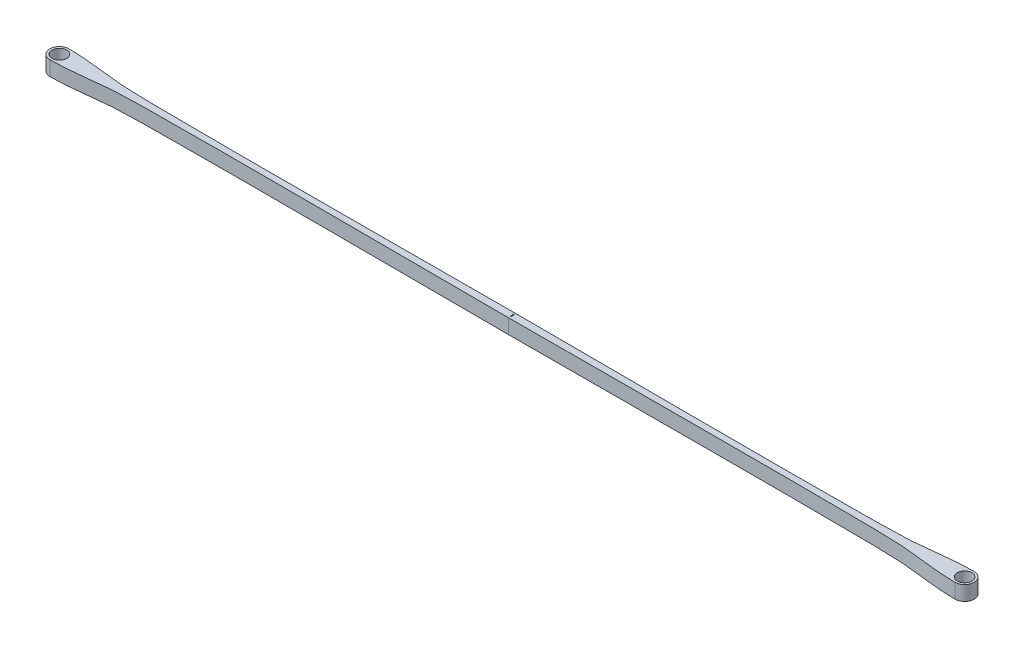
ISO-10303-21;
HEADER;
FILE_DESCRIPTION(('STEP AP214'),'2;1');
FILE_NAME('part.step','',(''),(''),'','','');
FILE_SCHEMA(('AUTOMOTIVE_DESIGN { 1 0 10303 214 1 1 1 1 }'));
ENDSEC;
DATA;
#1=APPLICATION_CONTEXT('core data for automotive mechanical design processes');
#2=APPLICATION_PROTOCOL_DEFINITION('international standard','automotive_design',2000,#1);
#3=PRODUCT_CONTEXT('',#1,'mechanical');
#4=PRODUCT('Part','Part','',(#3));
#5=PRODUCT_RELATED_PRODUCT_CATEGORY('part','',(#4));
#6=PRODUCT_DEFINITION_FORMATION('','',#4);
#7=PRODUCT_DEFINITION_CONTEXT('part definition',#1,'design');
#8=PRODUCT_DEFINITION('design','',#6,#7);
#9=PRODUCT_DEFINITION_SHAPE('','',#8);
#10=(LENGTH_UNIT() NAMED_UNIT(*) SI_UNIT(.MILLI.,.METRE.));
#11=(NAMED_UNIT(*) PLANE_ANGLE_UNIT() SI_UNIT($,.RADIAN.));
#12=(NAMED_UNIT(*) SI_UNIT($,.STERADIAN.) SOLID_ANGLE_UNIT());
#13=UNCERTAINTY_MEASURE_WITH_UNIT(LENGTH_MEASURE(1.E-05),#10,'distance_accuracy_value','');
#14=(GEOMETRIC_REPRESENTATION_CONTEXT(3) GLOBAL_UNCERTAINTY_ASSIGNED_CONTEXT((#13)) GLOBAL_UNIT_ASSIGNED_CONTEXT((#10,
#11,#12)) REPRESENTATION_CONTEXT('',''));
#15=CARTESIAN_POINT('',(0.,0.,0.));
#16=DIRECTION('',(0.,0.,1.));
#17=DIRECTION('',(1.,0.,0.));
#18=AXIS2_PLACEMENT_3D('',#15,#16,#17);
#19=CARTESIAN_POINT('',(0.,2.,1.30000507237961));
#20=CARTESIAN_POINT('',(2.1582956686711,2.,1.30000507237961));
#21=CARTESIAN_POINT('',(7.60592517311194,2.,0.548342251474103));
#22=CARTESIAN_POINT('',(11.061575129074,2.,0.324012224077829));
#23=CARTESIAN_POINT('',(61.9,2.,0.5));
#24=B_SPLINE_CURVE_WITH_KNOTS('',3,(#19,#20,#21,#22,#23),.UNSPECIFIED.,.F.,.F.,(4,1,4),(0.,
0.427834461323006,1.),.UNSPECIFIED.);
#25=DIRECTION('',(0.,-1.,0.));
#26=VECTOR('',#25,1.);
#27=SURFACE_OF_LINEAR_EXTRUSION('',#24,#26);
#28=CARTESIAN_POINT('',(0.,0.,1.30000507237961));
#29=CARTESIAN_POINT('',(2.1582956686711,0.,1.30000507237961));
#30=CARTESIAN_POINT('',(7.60592517311194,0.,0.548342251474103));
#31=CARTESIAN_POINT('',(11.061575129074,0.,0.324012224077829));
#32=CARTESIAN_POINT('',(61.9,0.,0.5));
#33=B_SPLINE_CURVE_WITH_KNOTS('',3,(#28,#29,#30,#31,#32),.UNSPECIFIED.,.F.,.F.,(4,1,4),(0.,
0.427834461323006,1.),.UNSPECIFIED.);
#34=CARTESIAN_POINT('',(0.,0.,1.30000507237961));
#35=VERTEX_POINT('',#34);
#36=CARTESIAN_POINT('',(61.9,0.,0.5));
#37=VERTEX_POINT('',#36);
#38=EDGE_CURVE('E280',#35,#37,#33,.T.);
#39=ORIENTED_EDGE('',*,*,#38,.T.);
#40=DIRECTION('',(0.,-1.,0.));
#41=VECTOR('',#40,1.);
#42=CARTESIAN_POINT('',(61.9,2.,0.5));
#43=LINE('',#42,#41);
#44=CARTESIAN_POINT('',(61.9,2.,0.5));
#45=VERTEX_POINT('',#44);
#46=EDGE_CURVE('E107',#45,#37,#43,.T.);
#47=ORIENTED_EDGE('',*,*,#46,.F.);
#48=CARTESIAN_POINT('',(0.,2.,1.30000507237961));
#49=VERTEX_POINT('',#48);
#50=EDGE_CURVE('E275',#49,#45,#24,.T.);
#51=ORIENTED_EDGE('',*,*,#50,.F.);
#52=DIRECTION('',(0.,-1.,0.));
#53=VECTOR('',#52,1.);
#54=CARTESIAN_POINT('',(0.,2.,1.30000507237961));
#55=LINE('',#54,#53);
#56=EDGE_CURVE('E14',#49,#35,#55,.T.);
#57=ORIENTED_EDGE('',*,*,#56,.T.);
#58=EDGE_LOOP('',(#39,#47,#51,#57));
#59=FACE_BOUND('',#58,.T.);
#60=ADVANCED_FACE('F98',(#59),#27,.F.);
#61=CARTESIAN_POINT('',(0.,2.,-1.30000507237961));
#62=CARTESIAN_POINT('',(2.1582956686711,2.,-1.30000507237961));
#63=CARTESIAN_POINT('',(7.60592517311194,2.,-0.548342251474103));
#64=CARTESIAN_POINT('',(11.061575129074,2.,-0.324012224077829));
#65=CARTESIAN_POINT('',(61.9,2.,-0.5));
#66=B_SPLINE_CURVE_WITH_KNOTS('',3,(#61,#62,#63,#64,#65),.UNSPECIFIED.,.F.,.F.,(4,1,4),(0.,
0.427834461323006,1.),.UNSPECIFIED.);
#67=DIRECTION('',(0.,-1.,0.));
#68=VECTOR('',#67,1.);
#69=SURFACE_OF_LINEAR_EXTRUSION('',#66,#68);
#70=CARTESIAN_POINT('',(0.,0.,-1.30000507237961));
#71=CARTESIAN_POINT('',(2.1582956686711,0.,-1.30000507237961));
#72=CARTESIAN_POINT('',(7.60592517311194,0.,-0.548342251474103));
#73=CARTESIAN_POINT('',(11.061575129074,0.,-0.324012224077829));
#74=CARTESIAN_POINT('',(61.9,0.,-0.5));
#75=B_SPLINE_CURVE_WITH_KNOTS('',3,(#70,#71,#72,#73,#74),.UNSPECIFIED.,.F.,.F.,(4,1,4),(0.,
0.427834461323006,1.),.UNSPECIFIED.);
#76=CARTESIAN_POINT('',(0.,0.,-1.30000507237961));
#77=VERTEX_POINT('',#76);
#78=CARTESIAN_POINT('',(61.9,0.,-0.5));
#79=VERTEX_POINT('',#78);
#80=EDGE_CURVE('E287',#77,#79,#75,.T.);
#81=ORIENTED_EDGE('',*,*,#80,.F.);
#82=DIRECTION('',(0.,-1.,0.));
#83=VECTOR('',#82,1.);
#84=CARTESIAN_POINT('',(0.,2.,-1.30000507237961));
#85=LINE('',#84,#83);
#86=CARTESIAN_POINT('',(0.,2.,-1.30000507237961));
#87=VERTEX_POINT('',#86);
#88=EDGE_CURVE('E124',#87,#77,#85,.T.);
#89=ORIENTED_EDGE('',*,*,#88,.F.);
#90=CARTESIAN_POINT('',(61.9,2.,-0.5));
#91=VERTEX_POINT('',#90);
#92=EDGE_CURVE('E270',#87,#91,#66,.T.);
#93=ORIENTED_EDGE('',*,*,#92,.T.);
#94=DIRECTION('',(0.,-1.,0.));
#95=VECTOR('',#94,1.);
#96=CARTESIAN_POINT('',(61.9,2.,-0.5));
#97=LINE('',#96,#95);
#98=EDGE_CURVE('E300',#91,#79,#97,.T.);
#99=ORIENTED_EDGE('',*,*,#98,.T.);
#100=EDGE_LOOP('',(#81,#89,#93,#99));
#101=FACE_BOUND('',#100,.T.);
#102=ADVANCED_FACE('F265',(#101),#69,.T.);
#103=CARTESIAN_POINT('',(0.,0.,0.));
#104=DIRECTION('',(0.,1.,0.));
#105=DIRECTION('',(0.,0.,1.));
#106=AXIS2_PLACEMENT_3D('',#103,#104,#105);
#107=PLANE('',#106);
#108=CARTESIAN_POINT('',(123.8,0.,0.));
#109=DIRECTION('',(0.,-1.,0.));
#110=DIRECTION('',(0.,0.,1.));
#111=AXIS2_PLACEMENT_3D('',#108,#109,#110);
#112=CIRCLE('',#111,1.);
#113=CARTESIAN_POINT('',(123.8,0.,1.));
#114=VERTEX_POINT('',#113);
#115=EDGE_CURVE('E219',#114,#114,#112,.T.);
#116=ORIENTED_EDGE('',*,*,#115,.F.);
#117=EDGE_LOOP('',(#116));
#118=FACE_BOUND('',#117,.T.);
#119=CARTESIAN_POINT('',(0.,0.,0.));
#120=DIRECTION('',(0.,1.,0.));
#121=DIRECTION('',(0.,0.,1.));
#122=AXIS2_PLACEMENT_3D('',#119,#120,#121);
#123=CIRCLE('',#122,1.);
#124=CARTESIAN_POINT('',(0.,0.,1.));
#125=VERTEX_POINT('',#124);
#126=EDGE_CURVE('E306',#125,#125,#123,.T.);
#127=ORIENTED_EDGE('',*,*,#126,.T.);
#128=EDGE_LOOP('',(#127));
#129=FACE_BOUND('',#128,.T.);
#130=ORIENTED_EDGE('',*,*,#38,.F.);
#131=CARTESIAN_POINT('',(0.,0.,0.));
#132=DIRECTION('',(0.,1.,0.));
#133=DIRECTION('',(0.,0.,1.));
#134=AXIS2_PLACEMENT_3D('',#131,#132,#133);
#135=CIRCLE('',#134,1.30000507237961);
#136=EDGE_CURVE('E102',#77,#35,#135,.T.);
#137=ORIENTED_EDGE('',*,*,#136,.F.);
#138=ORIENTED_EDGE('',*,*,#80,.T.);
#139=CARTESIAN_POINT('',(123.8,0.,-1.30000507237961));
#140=CARTESIAN_POINT('',(121.641704331329,0.,-1.30000507237961));
#141=CARTESIAN_POINT('',(116.194074826888,0.,-0.548342251474103));
#142=CARTESIAN_POINT('',(112.738424870926,0.,-0.324012224077829));
#143=CARTESIAN_POINT('',(61.9,0.,-0.5));
#144=B_SPLINE_CURVE_WITH_KNOTS('',3,(#139,#140,#141,#142,#143),.UNSPECIFIED.,.F.,.F.,(4,1,4),
(0.,0.427834461323006,1.),.UNSPECIFIED.);
#145=CARTESIAN_POINT('',(123.8,0.,-1.30000507237961));
#146=VERTEX_POINT('',#145);
#147=EDGE_CURVE('E228',#146,#79,#144,.T.);
#148=ORIENTED_EDGE('',*,*,#147,.F.);
#149=CARTESIAN_POINT('',(123.8,0.,0.));
#150=DIRECTION('',(0.,-1.,0.));
#151=DIRECTION('',(0.,0.,1.));
#152=AXIS2_PLACEMENT_3D('',#149,#150,#151);
#153=CIRCLE('',#152,1.30000507237961);
#154=CARTESIAN_POINT('',(123.8,0.,1.30000507237961));
#155=VERTEX_POINT('',#154);
#156=EDGE_CURVE('E222',#146,#155,#153,.T.);
#157=ORIENTED_EDGE('',*,*,#156,.T.);
#158=CARTESIAN_POINT('',(123.8,0.,1.30000507237961));
#159=CARTESIAN_POINT('',(121.641704331329,0.,1.30000507237961));
#160=CARTESIAN_POINT('',(116.194074826888,0.,0.548342251474103));
#161=CARTESIAN_POINT('',(112.738424870926,0.,0.324012224077829));
#162=CARTESIAN_POINT('',(61.9,0.,0.5));
#163=B_SPLINE_CURVE_WITH_KNOTS('',3,(#158,#159,#160,#161,#162),.UNSPECIFIED.,.F.,.F.,(4,1,4),
(0.,0.427834461323006,1.),.UNSPECIFIED.);
#164=EDGE_CURVE('E238',#155,#37,#163,.T.);
#165=ORIENTED_EDGE('',*,*,#164,.T.);
#166=EDGE_LOOP('',(#130,#137,#138,#148,#157,#165));
#167=FACE_BOUND('',#166,.T.);
#168=ADVANCED_FACE('F261',(#118,#129,#167),#107,.F.);
#169=CARTESIAN_POINT('',(0.,2.,0.));
#170=DIRECTION('',(0.,1.,0.));
#171=DIRECTION('',(0.,0.,1.));
#172=AXIS2_PLACEMENT_3D('',#169,#170,#171);
#173=PLANE('',#172);
#174=DIRECTION('',(0.,0.,1.));
#175=VECTOR('',#174,1.);
#176=CARTESIAN_POINT('',(61.85,2.,0.200005072379613));
#177=LINE('',#176,#175);
#178=CARTESIAN_POINT('',(61.85,2.,-0.299994927620387));
#179=VERTEX_POINT('',#178);
#180=CARTESIAN_POINT('',(61.85,2.,0.200005072379613));
#181=VERTEX_POINT('',#180);
#182=EDGE_CURVE('E115',#179,#181,#177,.T.);
#183=ORIENTED_EDGE('',*,*,#182,.F.);
#184=DIRECTION('',(-1.,0.,0.));
#185=VECTOR('',#184,1.);
#186=CARTESIAN_POINT('',(61.85,2.,-0.299994927620387));
#187=LINE('',#186,#185);
#188=CARTESIAN_POINT('',(61.95,2.,-0.299994927620387));
#189=VERTEX_POINT('',#188);
#190=EDGE_CURVE('E200',#189,#179,#187,.T.);
#191=ORIENTED_EDGE('',*,*,#190,.F.);
#192=DIRECTION('',(0.,0.,-1.));
#193=VECTOR('',#192,1.);
#194=CARTESIAN_POINT('',(61.95,2.,0.200005072379613));
#195=LINE('',#194,#193);
#196=CARTESIAN_POINT('',(61.95,2.,0.200005072379613));
#197=VERTEX_POINT('',#196);
#198=EDGE_CURVE('E203',#197,#189,#195,.T.);
#199=ORIENTED_EDGE('',*,*,#198,.F.);
#200=DIRECTION('',(1.,0.,0.));
#201=VECTOR('',#200,1.);
#202=CARTESIAN_POINT('',(61.85,2.,0.200005072379613));
#203=LINE('',#202,#201);
#204=EDGE_CURVE('E209',#181,#197,#203,.T.);
#205=ORIENTED_EDGE('',*,*,#204,.F.);
#206=EDGE_LOOP('',(#183,#191,#199,#205));
#207=FACE_BOUND('',#206,.T.);
#208=CARTESIAN_POINT('',(123.8,2.,0.));
#209=DIRECTION('',(0.,-1.,0.));
#210=DIRECTION('',(0.,0.,1.));
#211=AXIS2_PLACEMENT_3D('',#208,#209,#210);
#212=CIRCLE('',#211,1.);
#213=CARTESIAN_POINT('',(123.8,2.,1.));
#214=VERTEX_POINT('',#213);
#215=EDGE_CURVE('E215',#214,#214,#212,.T.);
#216=ORIENTED_EDGE('',*,*,#215,.T.);
#217=EDGE_LOOP('',(#216));
#218=FACE_BOUND('',#217,.T.);
#219=CARTESIAN_POINT('',(0.,2.,0.));
#220=DIRECTION('',(0.,1.,0.));
#221=DIRECTION('',(0.,0.,1.));
#222=AXIS2_PLACEMENT_3D('',#219,#220,#221);
#223=CIRCLE('',#222,1.);
#224=CARTESIAN_POINT('',(0.,2.,1.));
#225=VERTEX_POINT('',#224);
#226=EDGE_CURVE('E309',#225,#225,#223,.T.);
#227=ORIENTED_EDGE('',*,*,#226,.F.);
#228=EDGE_LOOP('',(#227));
#229=FACE_BOUND('',#228,.T.);
#230=ORIENTED_EDGE('',*,*,#92,.F.);
#231=CARTESIAN_POINT('',(0.,2.,0.));
#232=DIRECTION('',(0.,1.,0.));
#233=DIRECTION('',(0.,0.,1.));
#234=AXIS2_PLACEMENT_3D('',#231,#232,#233);
#235=CIRCLE('',#234,1.30000507237961);
#236=EDGE_CURVE('E288',#87,#49,#235,.T.);
#237=ORIENTED_EDGE('',*,*,#236,.T.);
#238=ORIENTED_EDGE('',*,*,#50,.T.);
#239=CARTESIAN_POINT('',(123.8,2.,1.30000507237961));
#240=CARTESIAN_POINT('',(121.641704331329,2.,1.30000507237961));
#241=CARTESIAN_POINT('',(116.194074826888,2.,0.548342251474103));
#242=CARTESIAN_POINT('',(112.738424870926,2.,0.324012224077829));
#243=CARTESIAN_POINT('',(61.9,2.,0.5));
#244=B_SPLINE_CURVE_WITH_KNOTS('',3,(#239,#240,#241,#242,#243),.UNSPECIFIED.,.F.,.F.,(4,1,4),
(0.,0.427834461323006,1.),.UNSPECIFIED.);
#245=CARTESIAN_POINT('',(123.8,2.,1.30000507237961));
#246=VERTEX_POINT('',#245);
#247=EDGE_CURVE('E237',#246,#45,#244,.T.);
#248=ORIENTED_EDGE('',*,*,#247,.F.);
#249=CARTESIAN_POINT('',(123.8,2.,0.));
#250=DIRECTION('',(0.,-1.,0.));
#251=DIRECTION('',(0.,0.,1.));
#252=AXIS2_PLACEMENT_3D('',#249,#250,#251);
#253=CIRCLE('',#252,1.30000507237961);
#254=CARTESIAN_POINT('',(123.8,2.,-1.30000507237961));
#255=VERTEX_POINT('',#254);
#256=EDGE_CURVE('E225',#255,#246,#253,.T.);
#257=ORIENTED_EDGE('',*,*,#256,.F.);
#258=CARTESIAN_POINT('',(123.8,2.,-1.30000507237961));
#259=CARTESIAN_POINT('',(121.641704331329,2.,-1.30000507237961));
#260=CARTESIAN_POINT('',(116.194074826888,2.,-0.548342251474103));
#261=CARTESIAN_POINT('',(112.738424870926,2.,-0.324012224077829));
#262=CARTESIAN_POINT('',(61.9,2.,-0.5));
#263=B_SPLINE_CURVE_WITH_KNOTS('',3,(#258,#259,#260,#261,#262),.UNSPECIFIED.,.F.,.F.,(4,1,4),
(0.,0.427834461323006,1.),.UNSPECIFIED.);
#264=EDGE_CURVE('E231',#255,#91,#263,.T.);
#265=ORIENTED_EDGE('',*,*,#264,.T.);
#266=EDGE_LOOP('',(#230,#237,#238,#248,#257,#265));
#267=FACE_BOUND('',#266,.T.);
#268=ADVANCED_FACE('F258',(#207,#218,#229,#267),#173,.T.);
#269=CARTESIAN_POINT('',(0.,2.,0.));
#270=DIRECTION('',(0.,-1.,0.));
#271=DIRECTION('',(0.,0.,-1.));
#272=AXIS2_PLACEMENT_3D('',#269,#270,#271);
#273=CYLINDRICAL_SURFACE('',#272,1.30000507237961);
#274=ORIENTED_EDGE('',*,*,#56,.F.);
#275=ORIENTED_EDGE('',*,*,#236,.F.);
#276=ORIENTED_EDGE('',*,*,#88,.T.);
#277=ORIENTED_EDGE('',*,*,#136,.T.);
#278=EDGE_LOOP('',(#274,#275,#276,#277));
#279=FACE_BOUND('',#278,.T.);
#280=ADVANCED_FACE('F100',(#279),#273,.T.);
#281=CARTESIAN_POINT('',(0.,0.,0.));
#282=DIRECTION('',(0.,1.,0.));
#283=DIRECTION('',(0.,0.,1.));
#284=AXIS2_PLACEMENT_3D('',#281,#282,#283);
#285=CYLINDRICAL_SURFACE('',#284,1.);
#286=ORIENTED_EDGE('',*,*,#126,.F.);
#287=EDGE_LOOP('',(#286));
#288=FACE_BOUND('',#287,.T.);
#289=ORIENTED_EDGE('',*,*,#226,.T.);
#290=EDGE_LOOP('',(#289));
#291=FACE_BOUND('',#290,.T.);
#292=ADVANCED_FACE('F252',(#288,#291),#285,.F.);
#293=DIRECTION('',(0.,-1.,0.));
#294=VECTOR('',#293,1.);
#295=SURFACE_OF_LINEAR_EXTRUSION('',#263,#294);
#296=ORIENTED_EDGE('',*,*,#147,.T.);
#297=ORIENTED_EDGE('',*,*,#98,.F.);
#298=ORIENTED_EDGE('',*,*,#264,.F.);
#299=DIRECTION('',(0.,-1.,0.));
#300=VECTOR('',#299,1.);
#301=CARTESIAN_POINT('',(123.8,2.,-1.30000507237961));
#302=LINE('',#301,#300);
#303=EDGE_CURVE('E314',#255,#146,#302,.T.);
#304=ORIENTED_EDGE('',*,*,#303,.T.);
#305=EDGE_LOOP('',(#296,#297,#298,#304));
#306=FACE_BOUND('',#305,.T.);
#307=ADVANCED_FACE('F247',(#306),#295,.F.);
#308=DIRECTION('',(0.,-1.,0.));
#309=VECTOR('',#308,1.);
#310=SURFACE_OF_LINEAR_EXTRUSION('',#244,#309);
#311=ORIENTED_EDGE('',*,*,#164,.F.);
#312=DIRECTION('',(0.,-1.,0.));
#313=VECTOR('',#312,1.);
#314=CARTESIAN_POINT('',(123.8,2.,1.30000507237961));
#315=LINE('',#314,#313);
#316=EDGE_CURVE('E317',#246,#155,#315,.T.);
#317=ORIENTED_EDGE('',*,*,#316,.F.);
#318=ORIENTED_EDGE('',*,*,#247,.T.);
#319=ORIENTED_EDGE('',*,*,#46,.T.);
#320=EDGE_LOOP('',(#311,#317,#318,#319));
#321=FACE_BOUND('',#320,.T.);
#322=ADVANCED_FACE('F251',(#321),#310,.T.);
#323=CARTESIAN_POINT('',(123.8,2.,0.));
#324=DIRECTION('',(0.,-1.,0.));
#325=DIRECTION('',(0.,0.,-1.));
#326=AXIS2_PLACEMENT_3D('',#323,#324,#325);
#327=CYLINDRICAL_SURFACE('',#326,1.30000507237961);
#328=ORIENTED_EDGE('',*,*,#303,.F.);
#329=ORIENTED_EDGE('',*,*,#256,.T.);
#330=ORIENTED_EDGE('',*,*,#316,.T.);
#331=ORIENTED_EDGE('',*,*,#156,.F.);
#332=EDGE_LOOP('',(#328,#329,#330,#331));
#333=FACE_BOUND('',#332,.T.);
#334=ADVANCED_FACE('F338',(#333),#327,.T.);
#335=CARTESIAN_POINT('',(123.8,0.,0.));
#336=DIRECTION('',(0.,1.,0.));
#337=DIRECTION('',(0.,0.,1.));
#338=AXIS2_PLACEMENT_3D('',#335,#336,#337);
#339=CYLINDRICAL_SURFACE('',#338,1.);
#340=ORIENTED_EDGE('',*,*,#115,.T.);
#341=EDGE_LOOP('',(#340));
#342=FACE_BOUND('',#341,.T.);
#343=ORIENTED_EDGE('',*,*,#215,.F.);
#344=EDGE_LOOP('',(#343));
#345=FACE_BOUND('',#344,.T.);
#346=ADVANCED_FACE('F386',(#342,#345),#339,.F.);
#347=CARTESIAN_POINT('',(61.85,1.5,0.200005072379613));
#348=DIRECTION('',(-1.,0.,0.));
#349=DIRECTION('',(0.,0.,1.));
#350=AXIS2_PLACEMENT_3D('',#347,#348,#349);
#351=PLANE('',#350);
#352=ORIENTED_EDGE('',*,*,#182,.T.);
#353=DIRECTION('',(0.,1.,0.));
#354=VECTOR('',#353,1.);
#355=CARTESIAN_POINT('',(61.85,1.5,0.200005072379613));
#356=LINE('',#355,#354);
#357=CARTESIAN_POINT('',(61.85,1.5,0.200005072379613));
#358=VERTEX_POINT('',#357);
#359=EDGE_CURVE('E178',#358,#181,#356,.T.);
#360=ORIENTED_EDGE('',*,*,#359,.F.);
#361=DIRECTION('',(0.,0.,1.));
#362=VECTOR('',#361,1.);
#363=CARTESIAN_POINT('',(61.85,1.5,0.200005072379613));
#364=LINE('',#363,#362);
#365=CARTESIAN_POINT('',(61.85,1.5,-0.299994927620387));
#366=VERTEX_POINT('',#365);
#367=EDGE_CURVE('E182',#366,#358,#364,.T.);
#368=ORIENTED_EDGE('',*,*,#367,.F.);
#369=DIRECTION('',(0.,1.,0.));
#370=VECTOR('',#369,1.);
#371=CARTESIAN_POINT('',(61.85,1.5,-0.299994927620387));
#372=LINE('',#371,#370);
#373=EDGE_CURVE('E213',#366,#179,#372,.T.);
#374=ORIENTED_EDGE('',*,*,#373,.T.);
#375=EDGE_LOOP('',(#352,#360,#368,#374));
#376=FACE_BOUND('',#375,.T.);
#377=ADVANCED_FACE('F180',(#376),#351,.F.);
#378=CARTESIAN_POINT('',(61.85,1.5,-0.299994927620387));
#379=DIRECTION('',(0.,0.,-1.));
#380=DIRECTION('',(-1.,0.,0.));
#381=AXIS2_PLACEMENT_3D('',#378,#379,#380);
#382=PLANE('',#381);
#383=ORIENTED_EDGE('',*,*,#190,.T.);
#384=ORIENTED_EDGE('',*,*,#373,.F.);
#385=DIRECTION('',(-1.,0.,0.));
#386=VECTOR('',#385,1.);
#387=CARTESIAN_POINT('',(61.85,1.5,-0.299994927620387));
#388=LINE('',#387,#386);
#389=CARTESIAN_POINT('',(61.95,1.5,-0.299994927620387));
#390=VERTEX_POINT('',#389);
#391=EDGE_CURVE('E188',#390,#366,#388,.T.);
#392=ORIENTED_EDGE('',*,*,#391,.F.);
#393=DIRECTION('',(0.,1.,0.));
#394=VECTOR('',#393,1.);
#395=CARTESIAN_POINT('',(61.95,1.5,-0.299994927620387));
#396=LINE('',#395,#394);
#397=EDGE_CURVE('E216',#390,#189,#396,.T.);
#398=ORIENTED_EDGE('',*,*,#397,.T.);
#399=EDGE_LOOP('',(#383,#384,#392,#398));
#400=FACE_BOUND('',#399,.T.);
#401=ADVANCED_FACE('F397',(#400),#382,.F.);
#402=CARTESIAN_POINT('',(61.95,1.5,0.200005072379613));
#403=DIRECTION('',(1.,0.,0.));
#404=DIRECTION('',(0.,0.,-1.));
#405=AXIS2_PLACEMENT_3D('',#402,#403,#404);
#406=PLANE('',#405);
#407=ORIENTED_EDGE('',*,*,#198,.T.);
#408=ORIENTED_EDGE('',*,*,#397,.F.);
#409=DIRECTION('',(0.,0.,-1.));
#410=VECTOR('',#409,1.);
#411=CARTESIAN_POINT('',(61.95,1.5,0.200005072379613));
#412=LINE('',#411,#410);
#413=CARTESIAN_POINT('',(61.95,1.5,0.200005072379613));
#414=VERTEX_POINT('',#413);
#415=EDGE_CURVE('E196',#414,#390,#412,.T.);
#416=ORIENTED_EDGE('',*,*,#415,.F.);
#417=DIRECTION('',(0.,1.,0.));
#418=VECTOR('',#417,1.);
#419=CARTESIAN_POINT('',(61.95,1.5,0.200005072379613));
#420=LINE('',#419,#418);
#421=EDGE_CURVE('E187',#414,#197,#420,.T.);
#422=ORIENTED_EDGE('',*,*,#421,.T.);
#423=EDGE_LOOP('',(#407,#408,#416,#422));
#424=FACE_BOUND('',#423,.T.);
#425=ADVANCED_FACE('F404',(#424),#406,.F.);
#426=CARTESIAN_POINT('',(61.85,1.5,0.200005072379613));
#427=DIRECTION('',(0.,0.,1.));
#428=DIRECTION('',(1.,0.,0.));
#429=AXIS2_PLACEMENT_3D('',#426,#427,#428);
#430=PLANE('',#429);
#431=ORIENTED_EDGE('',*,*,#204,.T.);
#432=ORIENTED_EDGE('',*,*,#421,.F.);
#433=DIRECTION('',(1.,0.,0.));
#434=VECTOR('',#433,1.);
#435=CARTESIAN_POINT('',(61.85,1.5,0.200005072379613));
#436=LINE('',#435,#434);
#437=EDGE_CURVE('E191',#358,#414,#436,.T.);
#438=ORIENTED_EDGE('',*,*,#437,.F.);
#439=ORIENTED_EDGE('',*,*,#359,.T.);
#440=EDGE_LOOP('',(#431,#432,#438,#439));
#441=FACE_BOUND('',#440,.T.);
#442=ADVANCED_FACE('F192',(#441),#430,.F.);
#443=CARTESIAN_POINT('',(0.,1.5,0.));
#444=DIRECTION('',(0.,-1.,0.));
#445=DIRECTION('',(0.,0.,-1.));
#446=AXIS2_PLACEMENT_3D('',#443,#444,#445);
#447=PLANE('',#446);
#448=ORIENTED_EDGE('',*,*,#367,.T.);
#449=ORIENTED_EDGE('',*,*,#437,.T.);
#450=ORIENTED_EDGE('',*,*,#415,.T.);
#451=ORIENTED_EDGE('',*,*,#391,.T.);
#452=EDGE_LOOP('',(#448,#449,#450,#451));
#453=FACE_BOUND('',#452,.T.);
#454=ADVANCED_FACE('F198',(#453),#447,.F.);
#455=CLOSED_SHELL('',(#60,#102,#168,#268,#280,#292,#307,#322,#334,#346,#377,#401,#425,#442,#454));
#456=MANIFOLD_SOLID_BREP('B2',#455);
#457=ADVANCED_BREP_SHAPE_REPRESENTATION('',(#18,#456),#14);
#458=SHAPE_DEFINITION_REPRESENTATION(#9,#457);
ENDSEC;
END-ISO-10303-21;
